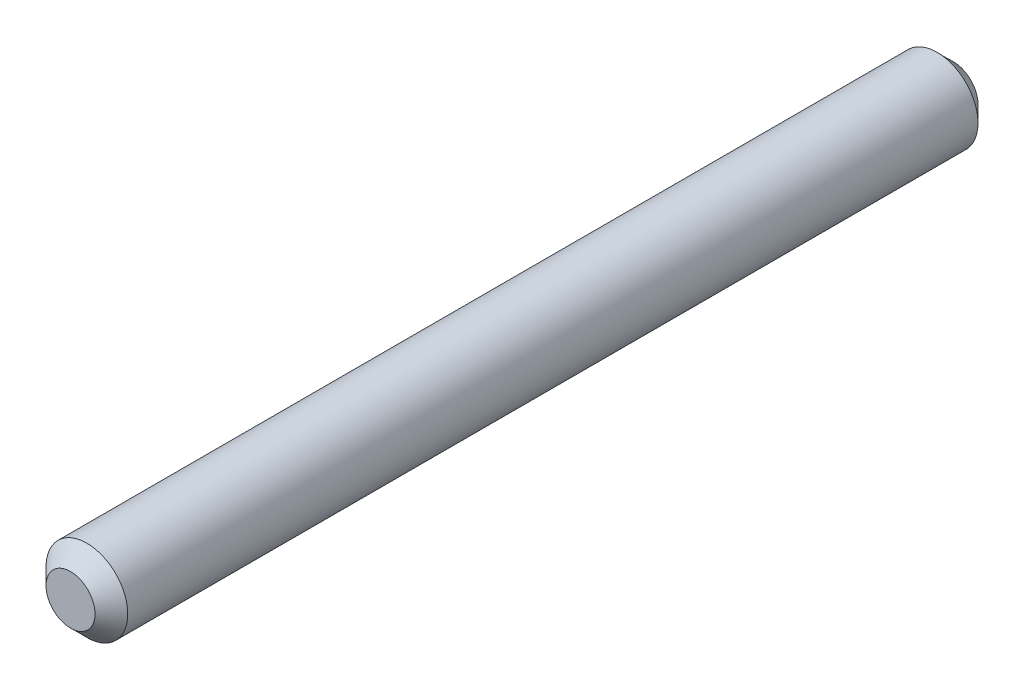
ISO-10303-21;
HEADER;
FILE_DESCRIPTION(('STEP AP214'),'2;1');
FILE_NAME('part.step','',(''),(''),'','','');
FILE_SCHEMA(('AUTOMOTIVE_DESIGN { 1 0 10303 214 1 1 1 1 }'));
ENDSEC;
DATA;
#1=APPLICATION_CONTEXT('core data for automotive mechanical design processes');
#2=APPLICATION_PROTOCOL_DEFINITION('international standard','automotive_design',2000,#1);
#3=PRODUCT_CONTEXT('',#1,'mechanical');
#4=PRODUCT('Part','Part','',(#3));
#5=PRODUCT_RELATED_PRODUCT_CATEGORY('part','',(#4));
#6=PRODUCT_DEFINITION_FORMATION('','',#4);
#7=PRODUCT_DEFINITION_CONTEXT('part definition',#1,'design');
#8=PRODUCT_DEFINITION('design','',#6,#7);
#9=PRODUCT_DEFINITION_SHAPE('','',#8);
#10=(LENGTH_UNIT() NAMED_UNIT(*) SI_UNIT(.MILLI.,.METRE.));
#11=(NAMED_UNIT(*) PLANE_ANGLE_UNIT() SI_UNIT($,.RADIAN.));
#12=(NAMED_UNIT(*) SI_UNIT($,.STERADIAN.) SOLID_ANGLE_UNIT());
#13=UNCERTAINTY_MEASURE_WITH_UNIT(LENGTH_MEASURE(1.E-05),#10,'distance_accuracy_value','');
#14=(GEOMETRIC_REPRESENTATION_CONTEXT(3) GLOBAL_UNCERTAINTY_ASSIGNED_CONTEXT((#13)) GLOBAL_UNIT_ASSIGNED_CONTEXT((#10,
#11,#12)) REPRESENTATION_CONTEXT('',''));
#15=CARTESIAN_POINT('',(0.,0.,0.));
#16=DIRECTION('',(0.,0.,1.));
#17=DIRECTION('',(1.,0.,0.));
#18=AXIS2_PLACEMENT_3D('',#15,#16,#17);
#19=CARTESIAN_POINT('',(0.,0.,27.));
#20=DIRECTION('',(0.,0.,-1.));
#21=DIRECTION('',(-1.,0.,0.));
#22=AXIS2_PLACEMENT_3D('',#19,#20,#21);
#23=CYLINDRICAL_SURFACE('',#22,2.5);
#24=CARTESIAN_POINT('',(0.,0.,-26.));
#25=DIRECTION('',(0.,0.,1.));
#26=DIRECTION('',(1.,0.,0.));
#27=AXIS2_PLACEMENT_3D('',#24,#25,#26);
#28=CIRCLE('',#27,2.5);
#29=CARTESIAN_POINT('',(2.5,0.,-26.));
#30=VERTEX_POINT('',#29);
#31=EDGE_CURVE('E53',#30,#30,#28,.T.);
#32=ORIENTED_EDGE('',*,*,#31,.T.);
#33=EDGE_LOOP('',(#32));
#34=FACE_BOUND('',#33,.T.);
#35=CARTESIAN_POINT('',(0.,0.,26.));
#36=DIRECTION('',(0.,0.,1.));
#37=DIRECTION('',(1.,0.,0.));
#38=AXIS2_PLACEMENT_3D('',#35,#36,#37);
#39=CIRCLE('',#38,2.5);
#40=CARTESIAN_POINT('',(2.5,0.,26.));
#41=VERTEX_POINT('',#40);
#42=EDGE_CURVE('E58',#41,#41,#39,.F.);
#43=ORIENTED_EDGE('',*,*,#42,.T.);
#44=EDGE_LOOP('',(#43));
#45=FACE_BOUND('',#44,.T.);
#46=ADVANCED_FACE('F39',(#34,#45),#23,.T.);
#47=CARTESIAN_POINT('',(0.,0.,27.));
#48=DIRECTION('',(0.,0.,1.));
#49=DIRECTION('',(1.,0.,0.));
#50=AXIS2_PLACEMENT_3D('',#47,#48,#49);
#51=PLANE('',#50);
#52=CARTESIAN_POINT('',(0.,0.,27.));
#53=DIRECTION('',(0.,0.,1.));
#54=DIRECTION('',(1.,0.,0.));
#55=AXIS2_PLACEMENT_3D('',#52,#53,#54);
#56=CIRCLE('',#55,1.5);
#57=CARTESIAN_POINT('',(1.5,0.,27.));
#58=VERTEX_POINT('',#57);
#59=EDGE_CURVE('E10',#58,#58,#56,.T.);
#60=ORIENTED_EDGE('',*,*,#59,.T.);
#61=EDGE_LOOP('',(#60));
#62=FACE_BOUND('',#61,.T.);
#63=ADVANCED_FACE('F75',(#62),#51,.T.);
#64=CARTESIAN_POINT('',(0.,0.,-27.));
#65=DIRECTION('',(0.,0.,1.));
#66=DIRECTION('',(1.,0.,0.));
#67=AXIS2_PLACEMENT_3D('',#64,#65,#66);
#68=PLANE('',#67);
#69=CARTESIAN_POINT('',(0.,0.,-27.));
#70=DIRECTION('',(0.,0.,1.));
#71=DIRECTION('',(1.,0.,0.));
#72=AXIS2_PLACEMENT_3D('',#69,#70,#71);
#73=CIRCLE('',#72,1.49999999999999);
#74=CARTESIAN_POINT('',(1.49999999999999,0.,-27.));
#75=VERTEX_POINT('',#74);
#76=EDGE_CURVE('E48',#75,#75,#73,.F.);
#77=ORIENTED_EDGE('',*,*,#76,.T.);
#78=EDGE_LOOP('',(#77));
#79=FACE_BOUND('',#78,.T.);
#80=ADVANCED_FACE('F72',(#79),#68,.F.);
#81=CARTESIAN_POINT('',(0.,0.,-26.));
#82=DIRECTION('',(0.,0.,1.));
#83=DIRECTION('',(1.,0.,0.));
#84=AXIS2_PLACEMENT_3D('',#81,#82,#83);
#85=CONICAL_SURFACE('',#84,2.5,0.785398163397447);
#86=ORIENTED_EDGE('',*,*,#76,.F.);
#87=EDGE_LOOP('',(#86));
#88=FACE_BOUND('',#87,.T.);
#89=ORIENTED_EDGE('',*,*,#31,.F.);
#90=EDGE_LOOP('',(#89));
#91=FACE_BOUND('',#90,.T.);
#92=ADVANCED_FACE('F68',(#88,#91),#85,.T.);
#93=CARTESIAN_POINT('',(0.,0.,27.));
#94=DIRECTION('',(0.,0.,-1.));
#95=DIRECTION('',(-1.,0.,0.));
#96=AXIS2_PLACEMENT_3D('',#93,#94,#95);
#97=CONICAL_SURFACE('',#96,1.5,0.785398163397444);
#98=ORIENTED_EDGE('',*,*,#42,.F.);
#99=EDGE_LOOP('',(#98));
#100=FACE_BOUND('',#99,.T.);
#101=ORIENTED_EDGE('',*,*,#59,.F.);
#102=EDGE_LOOP('',(#101));
#103=FACE_BOUND('',#102,.T.);
#104=ADVANCED_FACE('F42',(#100,#103),#97,.T.);
#105=CLOSED_SHELL('',(#46,#63,#80,#92,#104));
#106=MANIFOLD_SOLID_BREP('B2',#105);
#107=ADVANCED_BREP_SHAPE_REPRESENTATION('',(#18,#106),#14);
#108=SHAPE_DEFINITION_REPRESENTATION(#9,#107);
ENDSEC;
END-ISO-10303-21;
